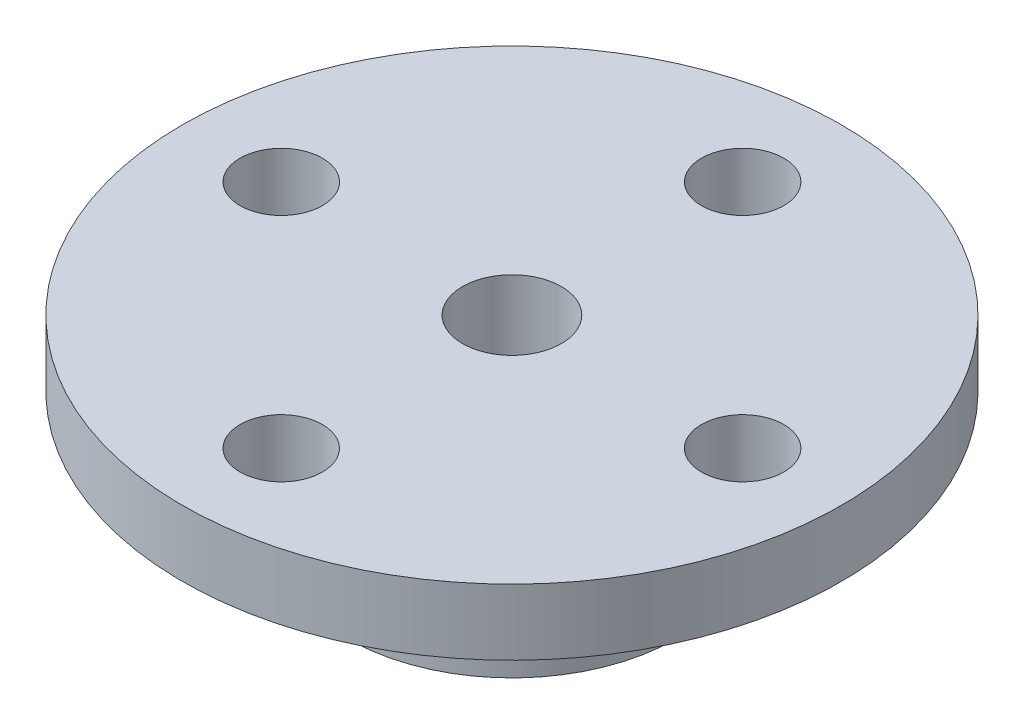
ISO-10303-21;
HEADER;
FILE_DESCRIPTION(('STEP AP214'),'2;1');
FILE_NAME('part.step','',(''),(''),'','','');
FILE_SCHEMA(('AUTOMOTIVE_DESIGN { 1 0 10303 214 1 1 1 1 }'));
ENDSEC;
DATA;
#1=APPLICATION_CONTEXT('core data for automotive mechanical design processes');
#2=APPLICATION_PROTOCOL_DEFINITION('international standard','automotive_design',2000,#1);
#3=PRODUCT_CONTEXT('',#1,'mechanical');
#4=PRODUCT('Part','Part','',(#3));
#5=PRODUCT_RELATED_PRODUCT_CATEGORY('part','',(#4));
#6=PRODUCT_DEFINITION_FORMATION('','',#4);
#7=PRODUCT_DEFINITION_CONTEXT('part definition',#1,'design');
#8=PRODUCT_DEFINITION('design','',#6,#7);
#9=PRODUCT_DEFINITION_SHAPE('','',#8);
#10=(LENGTH_UNIT() NAMED_UNIT(*) SI_UNIT(.MILLI.,.METRE.));
#11=(NAMED_UNIT(*) PLANE_ANGLE_UNIT() SI_UNIT($,.RADIAN.));
#12=(NAMED_UNIT(*) SI_UNIT($,.STERADIAN.) SOLID_ANGLE_UNIT());
#13=UNCERTAINTY_MEASURE_WITH_UNIT(LENGTH_MEASURE(1.E-05),#10,'distance_accuracy_value','');
#14=(GEOMETRIC_REPRESENTATION_CONTEXT(3) GLOBAL_UNCERTAINTY_ASSIGNED_CONTEXT((#13)) GLOBAL_UNIT_ASSIGNED_CONTEXT((#10,
#11,#12)) REPRESENTATION_CONTEXT('',''));
#15=CARTESIAN_POINT('',(0.,0.,0.));
#16=DIRECTION('',(0.,0.,1.));
#17=DIRECTION('',(1.,0.,0.));
#18=AXIS2_PLACEMENT_3D('',#15,#16,#17);
#19=CARTESIAN_POINT('',(5.,-6.,0.));
#20=DIRECTION('',(0.,1.,0.));
#21=DIRECTION('',(-1.,0.,0.));
#22=AXIS2_PLACEMENT_3D('',#19,#20,#21);
#23=PLANE('',#22);
#24=CARTESIAN_POINT('',(0.,-6.,0.));
#25=DIRECTION('',(0.,1.,0.));
#26=DIRECTION('',(-1.,0.,0.));
#27=AXIS2_PLACEMENT_3D('',#24,#25,#26);
#28=CIRCLE('',#27,3.);
#29=CARTESIAN_POINT('',(-3.,-6.,0.));
#30=VERTEX_POINT('',#29);
#31=EDGE_CURVE('E18',#30,#30,#28,.T.);
#32=ORIENTED_EDGE('',*,*,#31,.T.);
#33=EDGE_LOOP('',(#32));
#34=FACE_BOUND('',#33,.T.);
#35=CARTESIAN_POINT('',(0.,-6.,0.));
#36=DIRECTION('',(0.,1.,0.));
#37=DIRECTION('',(-1.,0.,0.));
#38=AXIS2_PLACEMENT_3D('',#35,#36,#37);
#39=CIRCLE('',#38,5.);
#40=CARTESIAN_POINT('',(-5.,-6.,0.));
#41=VERTEX_POINT('',#40);
#42=EDGE_CURVE('E64',#41,#41,#39,.T.);
#43=ORIENTED_EDGE('',*,*,#42,.F.);
#44=EDGE_LOOP('',(#43));
#45=FACE_BOUND('',#44,.T.);
#46=ADVANCED_FACE('F15',(#34,#45),#23,.F.);
#47=CARTESIAN_POINT('',(0.,0.,0.));
#48=DIRECTION('',(0.,1.,0.));
#49=DIRECTION('',(-1.,0.,0.));
#50=AXIS2_PLACEMENT_3D('',#47,#48,#49);
#51=CYLINDRICAL_SURFACE('',#50,3.);
#52=ORIENTED_EDGE('',*,*,#31,.F.);
#53=EDGE_LOOP('',(#52));
#54=FACE_BOUND('',#53,.T.);
#55=CARTESIAN_POINT('',(0.,-3.,0.));
#56=DIRECTION('',(0.,1.,0.));
#57=DIRECTION('',(-1.,0.,0.));
#58=AXIS2_PLACEMENT_3D('',#55,#56,#57);
#59=CIRCLE('',#58,3.);
#60=CARTESIAN_POINT('',(-3.,-3.,0.));
#61=VERTEX_POINT('',#60);
#62=EDGE_CURVE('E62',#61,#61,#59,.T.);
#63=ORIENTED_EDGE('',*,*,#62,.T.);
#64=EDGE_LOOP('',(#63));
#65=FACE_BOUND('',#64,.T.);
#66=ADVANCED_FACE('F73',(#54,#65),#51,.F.);
#67=CARTESIAN_POINT('',(0.,0.,0.));
#68=DIRECTION('',(0.,1.,0.));
#69=DIRECTION('',(-1.,0.,0.));
#70=AXIS2_PLACEMENT_3D('',#67,#68,#69);
#71=CYLINDRICAL_SURFACE('',#70,5.);
#72=CARTESIAN_POINT('',(0.,-2.,0.));
#73=DIRECTION('',(0.,1.,0.));
#74=DIRECTION('',(-1.,0.,0.));
#75=AXIS2_PLACEMENT_3D('',#72,#73,#74);
#76=CIRCLE('',#75,5.);
#77=CARTESIAN_POINT('',(-5.,-2.,0.));
#78=VERTEX_POINT('',#77);
#79=EDGE_CURVE('E59',#78,#78,#76,.F.);
#80=ORIENTED_EDGE('',*,*,#79,.T.);
#81=EDGE_LOOP('',(#80));
#82=FACE_BOUND('',#81,.T.);
#83=ORIENTED_EDGE('',*,*,#42,.T.);
#84=EDGE_LOOP('',(#83));
#85=FACE_BOUND('',#84,.T.);
#86=ADVANCED_FACE('F76',(#82,#85),#71,.T.);
#87=CARTESIAN_POINT('',(1.5,-3.,0.));
#88=DIRECTION('',(0.,1.,0.));
#89=DIRECTION('',(-1.,0.,0.));
#90=AXIS2_PLACEMENT_3D('',#87,#88,#89);
#91=PLANE('',#90);
#92=CARTESIAN_POINT('',(0.,-3.,0.));
#93=DIRECTION('',(0.,1.,0.));
#94=DIRECTION('',(-1.,0.,0.));
#95=AXIS2_PLACEMENT_3D('',#92,#93,#94);
#96=CIRCLE('',#95,1.5);
#97=CARTESIAN_POINT('',(-1.5,-3.,0.));
#98=VERTEX_POINT('',#97);
#99=EDGE_CURVE('E44',#98,#98,#96,.T.);
#100=ORIENTED_EDGE('',*,*,#99,.T.);
#101=EDGE_LOOP('',(#100));
#102=FACE_BOUND('',#101,.T.);
#103=ORIENTED_EDGE('',*,*,#62,.F.);
#104=EDGE_LOOP('',(#103));
#105=FACE_BOUND('',#104,.T.);
#106=ADVANCED_FACE('F79',(#102,#105),#91,.F.);
#107=CARTESIAN_POINT('',(10.,-2.,0.));
#108=DIRECTION('',(0.,1.,0.));
#109=DIRECTION('',(-1.,0.,0.));
#110=AXIS2_PLACEMENT_3D('',#107,#108,#109);
#111=PLANE('',#110);
#112=ORIENTED_EDGE('',*,*,#79,.F.);
#113=EDGE_LOOP('',(#112));
#114=FACE_BOUND('',#113,.T.);
#115=CARTESIAN_POINT('',(0.,-2.,0.));
#116=DIRECTION('',(0.,1.,0.));
#117=DIRECTION('',(-1.,0.,0.));
#118=AXIS2_PLACEMENT_3D('',#115,#116,#117);
#119=CIRCLE('',#118,10.);
#120=CARTESIAN_POINT('',(-10.,-2.,0.));
#121=VERTEX_POINT('',#120);
#122=EDGE_CURVE('E41',#121,#121,#119,.T.);
#123=ORIENTED_EDGE('',*,*,#122,.F.);
#124=EDGE_LOOP('',(#123));
#125=FACE_BOUND('',#124,.T.);
#126=CARTESIAN_POINT('',(0.,-2.,-7.));
#127=DIRECTION('',(0.,-1.,0.));
#128=DIRECTION('',(0.,0.,-1.));
#129=AXIS2_PLACEMENT_3D('',#126,#127,#128);
#130=CIRCLE('',#129,1.24999999999999);
#131=CARTESIAN_POINT('',(0.,-2.,-8.24999999999999));
#132=VERTEX_POINT('',#131);
#133=EDGE_CURVE('E47',#132,#132,#130,.F.);
#134=ORIENTED_EDGE('',*,*,#133,.T.);
#135=EDGE_LOOP('',(#134));
#136=FACE_BOUND('',#135,.T.);
#137=CARTESIAN_POINT('',(7.,-2.,0.));
#138=DIRECTION('',(0.,-1.,0.));
#139=DIRECTION('',(0.,0.,-1.));
#140=AXIS2_PLACEMENT_3D('',#137,#138,#139);
#141=CIRCLE('',#140,1.24999999999999);
#142=CARTESIAN_POINT('',(7.,-2.,-1.24999999999999));
#143=VERTEX_POINT('',#142);
#144=EDGE_CURVE('E50',#143,#143,#141,.F.);
#145=ORIENTED_EDGE('',*,*,#144,.T.);
#146=EDGE_LOOP('',(#145));
#147=FACE_BOUND('',#146,.T.);
#148=CARTESIAN_POINT('',(0.,-2.,7.));
#149=DIRECTION('',(0.,-1.,0.));
#150=DIRECTION('',(0.,0.,-1.));
#151=AXIS2_PLACEMENT_3D('',#148,#149,#150);
#152=CIRCLE('',#151,1.24999999999999);
#153=CARTESIAN_POINT('',(0.,-2.,5.75000000000001));
#154=VERTEX_POINT('',#153);
#155=EDGE_CURVE('E53',#154,#154,#152,.F.);
#156=ORIENTED_EDGE('',*,*,#155,.T.);
#157=EDGE_LOOP('',(#156));
#158=FACE_BOUND('',#157,.T.);
#159=CARTESIAN_POINT('',(-7.,-2.,0.));
#160=DIRECTION('',(0.,-1.,0.));
#161=DIRECTION('',(0.,0.,-1.));
#162=AXIS2_PLACEMENT_3D('',#159,#160,#161);
#163=CIRCLE('',#162,1.24999999999999);
#164=CARTESIAN_POINT('',(-7.,-2.,-1.24999999999999));
#165=VERTEX_POINT('',#164);
#166=EDGE_CURVE('E56',#165,#165,#163,.F.);
#167=ORIENTED_EDGE('',*,*,#166,.T.);
#168=EDGE_LOOP('',(#167));
#169=FACE_BOUND('',#168,.T.);
#170=ADVANCED_FACE('F81',(#114,#125,#136,#147,#158,#169),#111,.F.);
#171=CARTESIAN_POINT('',(-7.,-2.,0.));
#172=DIRECTION('',(0.,-1.,0.));
#173=DIRECTION('',(0.,0.,-1.));
#174=AXIS2_PLACEMENT_3D('',#171,#172,#173);
#175=CYLINDRICAL_SURFACE('',#174,1.24999999999999);
#176=CARTESIAN_POINT('',(-7.,0.,0.));
#177=DIRECTION('',(0.,-1.,0.));
#178=DIRECTION('',(0.,0.,-1.));
#179=AXIS2_PLACEMENT_3D('',#176,#177,#178);
#180=CIRCLE('',#179,1.24999999999999);
#181=CARTESIAN_POINT('',(-7.,0.,-1.24999999999999));
#182=VERTEX_POINT('',#181);
#183=EDGE_CURVE('E38',#182,#182,#180,.F.);
#184=ORIENTED_EDGE('',*,*,#183,.T.);
#185=EDGE_LOOP('',(#184));
#186=FACE_BOUND('',#185,.T.);
#187=ORIENTED_EDGE('',*,*,#166,.F.);
#188=EDGE_LOOP('',(#187));
#189=FACE_BOUND('',#188,.T.);
#190=ADVANCED_FACE('F89',(#186,#189),#175,.F.);
#191=CARTESIAN_POINT('',(0.,-2.,7.));
#192=DIRECTION('',(0.,-1.,0.));
#193=DIRECTION('',(0.,0.,-1.));
#194=AXIS2_PLACEMENT_3D('',#191,#192,#193);
#195=CYLINDRICAL_SURFACE('',#194,1.24999999999999);
#196=CARTESIAN_POINT('',(0.,0.,7.));
#197=DIRECTION('',(0.,-1.,0.));
#198=DIRECTION('',(0.,0.,-1.));
#199=AXIS2_PLACEMENT_3D('',#196,#197,#198);
#200=CIRCLE('',#199,1.24999999999999);
#201=CARTESIAN_POINT('',(0.,0.,5.75000000000001));
#202=VERTEX_POINT('',#201);
#203=EDGE_CURVE('E35',#202,#202,#200,.F.);
#204=ORIENTED_EDGE('',*,*,#203,.T.);
#205=EDGE_LOOP('',(#204));
#206=FACE_BOUND('',#205,.T.);
#207=ORIENTED_EDGE('',*,*,#155,.F.);
#208=EDGE_LOOP('',(#207));
#209=FACE_BOUND('',#208,.T.);
#210=ADVANCED_FACE('F116',(#206,#209),#195,.F.);
#211=CARTESIAN_POINT('',(7.,-2.,0.));
#212=DIRECTION('',(0.,-1.,0.));
#213=DIRECTION('',(0.,0.,-1.));
#214=AXIS2_PLACEMENT_3D('',#211,#212,#213);
#215=CYLINDRICAL_SURFACE('',#214,1.24999999999999);
#216=CARTESIAN_POINT('',(7.,0.,0.));
#217=DIRECTION('',(0.,-1.,0.));
#218=DIRECTION('',(0.,0.,-1.));
#219=AXIS2_PLACEMENT_3D('',#216,#217,#218);
#220=CIRCLE('',#219,1.24999999999999);
#221=CARTESIAN_POINT('',(7.,0.,-1.24999999999999));
#222=VERTEX_POINT('',#221);
#223=EDGE_CURVE('E32',#222,#222,#220,.F.);
#224=ORIENTED_EDGE('',*,*,#223,.T.);
#225=EDGE_LOOP('',(#224));
#226=FACE_BOUND('',#225,.T.);
#227=ORIENTED_EDGE('',*,*,#144,.F.);
#228=EDGE_LOOP('',(#227));
#229=FACE_BOUND('',#228,.T.);
#230=ADVANCED_FACE('F112',(#226,#229),#215,.F.);
#231=CARTESIAN_POINT('',(0.,-2.,-7.));
#232=DIRECTION('',(0.,-1.,0.));
#233=DIRECTION('',(0.,0.,-1.));
#234=AXIS2_PLACEMENT_3D('',#231,#232,#233);
#235=CYLINDRICAL_SURFACE('',#234,1.24999999999999);
#236=CARTESIAN_POINT('',(0.,0.,-7.));
#237=DIRECTION('',(0.,-1.,0.));
#238=DIRECTION('',(0.,0.,-1.));
#239=AXIS2_PLACEMENT_3D('',#236,#237,#238);
#240=CIRCLE('',#239,1.24999999999999);
#241=CARTESIAN_POINT('',(0.,0.,-8.24999999999999));
#242=VERTEX_POINT('',#241);
#243=EDGE_CURVE('E27',#242,#242,#240,.F.);
#244=ORIENTED_EDGE('',*,*,#243,.T.);
#245=EDGE_LOOP('',(#244));
#246=FACE_BOUND('',#245,.T.);
#247=ORIENTED_EDGE('',*,*,#133,.F.);
#248=EDGE_LOOP('',(#247));
#249=FACE_BOUND('',#248,.T.);
#250=ADVANCED_FACE('F108',(#246,#249),#235,.F.);
#251=CARTESIAN_POINT('',(0.,0.,0.));
#252=DIRECTION('',(0.,1.,0.));
#253=DIRECTION('',(-1.,0.,0.));
#254=AXIS2_PLACEMENT_3D('',#251,#252,#253);
#255=CYLINDRICAL_SURFACE('',#254,1.5);
#256=ORIENTED_EDGE('',*,*,#99,.F.);
#257=EDGE_LOOP('',(#256));
#258=FACE_BOUND('',#257,.T.);
#259=CARTESIAN_POINT('',(0.,0.,0.));
#260=DIRECTION('',(0.,1.,0.));
#261=DIRECTION('',(-1.,0.,0.));
#262=AXIS2_PLACEMENT_3D('',#259,#260,#261);
#263=CIRCLE('',#262,1.5);
#264=CARTESIAN_POINT('',(-1.5,0.,0.));
#265=VERTEX_POINT('',#264);
#266=EDGE_CURVE('E22',#265,#265,#263,.T.);
#267=ORIENTED_EDGE('',*,*,#266,.T.);
#268=EDGE_LOOP('',(#267));
#269=FACE_BOUND('',#268,.T.);
#270=ADVANCED_FACE('F102',(#258,#269),#255,.F.);
#271=CARTESIAN_POINT('',(0.,0.,0.));
#272=DIRECTION('',(0.,1.,0.));
#273=DIRECTION('',(-1.,0.,0.));
#274=AXIS2_PLACEMENT_3D('',#271,#272,#273);
#275=CYLINDRICAL_SURFACE('',#274,10.);
#276=CARTESIAN_POINT('',(0.,0.,0.));
#277=DIRECTION('',(0.,1.,0.));
#278=DIRECTION('',(-1.,0.,0.));
#279=AXIS2_PLACEMENT_3D('',#276,#277,#278);
#280=CIRCLE('',#279,10.);
#281=CARTESIAN_POINT('',(-10.,0.,0.));
#282=VERTEX_POINT('',#281);
#283=EDGE_CURVE('E10',#282,#282,#280,.F.);
#284=ORIENTED_EDGE('',*,*,#283,.T.);
#285=EDGE_LOOP('',(#284));
#286=FACE_BOUND('',#285,.T.);
#287=ORIENTED_EDGE('',*,*,#122,.T.);
#288=EDGE_LOOP('',(#287));
#289=FACE_BOUND('',#288,.T.);
#290=ADVANCED_FACE('F96',(#286,#289),#275,.T.);
#291=CARTESIAN_POINT('',(10.,0.,0.));
#292=DIRECTION('',(0.,-1.,0.));
#293=DIRECTION('',(1.,0.,0.));
#294=AXIS2_PLACEMENT_3D('',#291,#292,#293);
#295=PLANE('',#294);
#296=ORIENTED_EDGE('',*,*,#283,.F.);
#297=EDGE_LOOP('',(#296));
#298=FACE_BOUND('',#297,.T.);
#299=ORIENTED_EDGE('',*,*,#266,.F.);
#300=EDGE_LOOP('',(#299));
#301=FACE_BOUND('',#300,.T.);
#302=ORIENTED_EDGE('',*,*,#243,.F.);
#303=EDGE_LOOP('',(#302));
#304=FACE_BOUND('',#303,.T.);
#305=ORIENTED_EDGE('',*,*,#223,.F.);
#306=EDGE_LOOP('',(#305));
#307=FACE_BOUND('',#306,.T.);
#308=ORIENTED_EDGE('',*,*,#203,.F.);
#309=EDGE_LOOP('',(#308));
#310=FACE_BOUND('',#309,.T.);
#311=ORIENTED_EDGE('',*,*,#183,.F.);
#312=EDGE_LOOP('',(#311));
#313=FACE_BOUND('',#312,.T.);
#314=ADVANCED_FACE('F94',(#298,#301,#304,#307,#310,#313),#295,.F.);
#315=CLOSED_SHELL('',(#46,#66,#86,#106,#170,#190,#210,#230,#250,#270,#290,#314));
#316=MANIFOLD_SOLID_BREP('B1',#315);
#317=ADVANCED_BREP_SHAPE_REPRESENTATION('',(#18,#316),#14);
#318=SHAPE_DEFINITION_REPRESENTATION(#9,#317);
ENDSEC;
END-ISO-10303-21;
